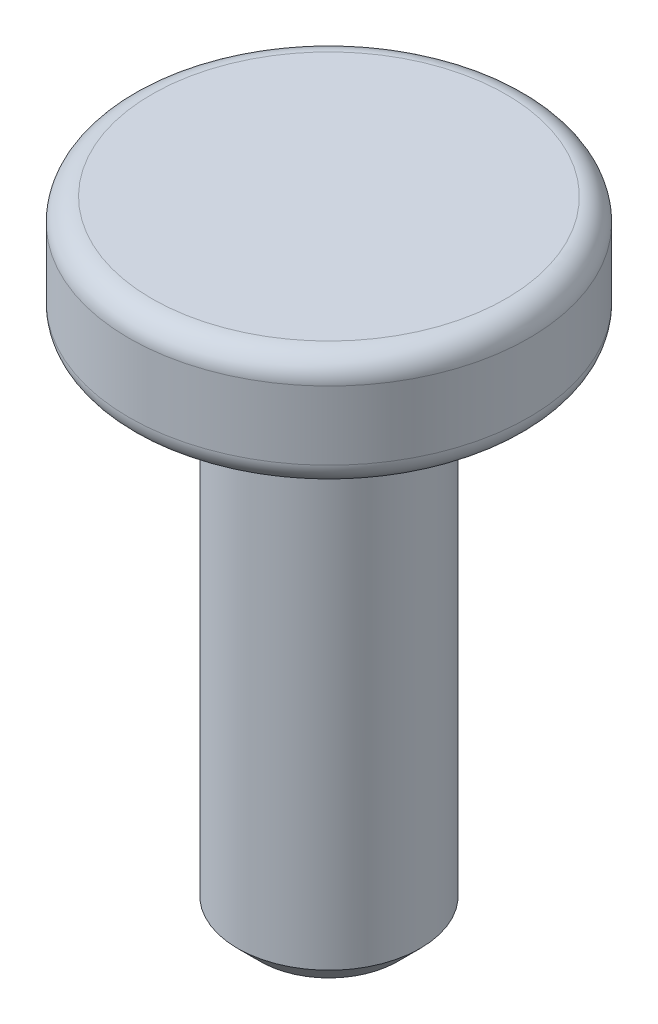
ISO-10303-21;
HEADER;
FILE_DESCRIPTION(('STEP AP214'),'2;1');
FILE_NAME('part.step','',(''),(''),'','','');
FILE_SCHEMA(('AUTOMOTIVE_DESIGN { 1 0 10303 214 1 1 1 1 }'));
ENDSEC;
DATA;
#1=APPLICATION_CONTEXT('core data for automotive mechanical design processes');
#2=APPLICATION_PROTOCOL_DEFINITION('international standard','automotive_design',2000,#1);
#3=PRODUCT_CONTEXT('',#1,'mechanical');
#4=PRODUCT('Part','Part','',(#3));
#5=PRODUCT_RELATED_PRODUCT_CATEGORY('part','',(#4));
#6=PRODUCT_DEFINITION_FORMATION('','',#4);
#7=PRODUCT_DEFINITION_CONTEXT('part definition',#1,'design');
#8=PRODUCT_DEFINITION('design','',#6,#7);
#9=PRODUCT_DEFINITION_SHAPE('','',#8);
#10=(LENGTH_UNIT() NAMED_UNIT(*) SI_UNIT(.MILLI.,.METRE.));
#11=(NAMED_UNIT(*) PLANE_ANGLE_UNIT() SI_UNIT($,.RADIAN.));
#12=(NAMED_UNIT(*) SI_UNIT($,.STERADIAN.) SOLID_ANGLE_UNIT());
#13=UNCERTAINTY_MEASURE_WITH_UNIT(LENGTH_MEASURE(1.E-05),#10,'distance_accuracy_value','');
#14=(GEOMETRIC_REPRESENTATION_CONTEXT(3) GLOBAL_UNCERTAINTY_ASSIGNED_CONTEXT((#13)) GLOBAL_UNIT_ASSIGNED_CONTEXT((#10,
#11,#12)) REPRESENTATION_CONTEXT('',''));
#15=CARTESIAN_POINT('',(0.,0.,0.));
#16=DIRECTION('',(0.,0.,1.));
#17=DIRECTION('',(1.,0.,0.));
#18=AXIS2_PLACEMENT_3D('',#15,#16,#17);
#19=CARTESIAN_POINT('',(0.,0.,0.));
#20=DIRECTION('',(0.,1.,0.));
#21=DIRECTION('',(0.,0.,1.));
#22=AXIS2_PLACEMENT_3D('',#19,#20,#21);
#23=PLANE('',#22);
#24=CARTESIAN_POINT('',(0.,0.,0.));
#25=DIRECTION('',(0.,1.,0.));
#26=DIRECTION('',(0.,0.,1.));
#27=AXIS2_PLACEMENT_3D('',#24,#25,#26);
#28=CIRCLE('',#27,1.55);
#29=CARTESIAN_POINT('',(0.,0.,1.55));
#30=VERTEX_POINT('',#29);
#31=EDGE_CURVE('E34',#30,#30,#28,.F.);
#32=ORIENTED_EDGE('',*,*,#31,.T.);
#33=EDGE_LOOP('',(#32));
#34=FACE_BOUND('',#33,.T.);
#35=CARTESIAN_POINT('',(0.,0.,0.));
#36=DIRECTION('',(0.,1.,0.));
#37=DIRECTION('',(0.,0.,1.));
#38=AXIS2_PLACEMENT_3D('',#35,#36,#37);
#39=CIRCLE('',#38,0.8);
#40=CARTESIAN_POINT('',(0.,0.,0.8));
#41=VERTEX_POINT('',#40);
#42=EDGE_CURVE('E25',#41,#41,#39,.F.);
#43=ORIENTED_EDGE('',*,*,#42,.F.);
#44=EDGE_LOOP('',(#43));
#45=FACE_BOUND('',#44,.T.);
#46=ADVANCED_FACE('F14',(#34,#45),#23,.F.);
#47=CARTESIAN_POINT('',(0.,1.,0.));
#48=DIRECTION('',(0.,-1.,0.));
#49=DIRECTION('',(0.,0.,-1.));
#50=AXIS2_PLACEMENT_3D('',#47,#48,#49);
#51=CYLINDRICAL_SURFACE('',#50,1.75);
#52=CARTESIAN_POINT('',(0.,0.2,0.));
#53=DIRECTION('',(0.,1.,0.));
#54=DIRECTION('',(0.,0.,1.));
#55=AXIS2_PLACEMENT_3D('',#52,#53,#54);
#56=CIRCLE('',#55,1.75);
#57=CARTESIAN_POINT('',(0.,0.2,1.75));
#58=VERTEX_POINT('',#57);
#59=EDGE_CURVE('E37',#58,#58,#56,.T.);
#60=ORIENTED_EDGE('',*,*,#59,.T.);
#61=EDGE_LOOP('',(#60));
#62=FACE_BOUND('',#61,.T.);
#63=CARTESIAN_POINT('',(0.,0.8,0.));
#64=DIRECTION('',(0.,1.,0.));
#65=DIRECTION('',(0.,0.,1.));
#66=AXIS2_PLACEMENT_3D('',#63,#64,#65);
#67=CIRCLE('',#66,1.75);
#68=CARTESIAN_POINT('',(0.,0.8,1.75));
#69=VERTEX_POINT('',#68);
#70=EDGE_CURVE('E40',#69,#69,#67,.F.);
#71=ORIENTED_EDGE('',*,*,#70,.T.);
#72=EDGE_LOOP('',(#71));
#73=FACE_BOUND('',#72,.T.);
#74=ADVANCED_FACE('F44',(#62,#73),#51,.T.);
#75=CARTESIAN_POINT('',(0.,1.,0.));
#76=DIRECTION('',(0.,1.,0.));
#77=DIRECTION('',(0.,0.,1.));
#78=AXIS2_PLACEMENT_3D('',#75,#76,#77);
#79=PLANE('',#78);
#80=CARTESIAN_POINT('',(0.,1.,0.));
#81=DIRECTION('',(0.,1.,0.));
#82=DIRECTION('',(0.,0.,1.));
#83=AXIS2_PLACEMENT_3D('',#80,#81,#82);
#84=CIRCLE('',#83,1.55);
#85=CARTESIAN_POINT('',(0.,1.,1.55));
#86=VERTEX_POINT('',#85);
#87=EDGE_CURVE('E29',#86,#86,#84,.T.);
#88=ORIENTED_EDGE('',*,*,#87,.T.);
#89=EDGE_LOOP('',(#88));
#90=FACE_BOUND('',#89,.T.);
#91=ADVANCED_FACE('F53',(#90),#79,.T.);
#92=CARTESIAN_POINT('',(0.,0.2,0.));
#93=DIRECTION('',(0.,1.,0.));
#94=DIRECTION('',(0.,0.,1.));
#95=AXIS2_PLACEMENT_3D('',#92,#93,#94);
#96=TOROIDAL_SURFACE('',#95,1.55,0.2);
#97=ORIENTED_EDGE('',*,*,#31,.F.);
#98=EDGE_LOOP('',(#97));
#99=FACE_BOUND('',#98,.T.);
#100=ORIENTED_EDGE('',*,*,#59,.F.);
#101=EDGE_LOOP('',(#100));
#102=FACE_BOUND('',#101,.T.);
#103=ADVANCED_FACE('F50',(#99,#102),#96,.T.);
#104=CARTESIAN_POINT('',(0.,0.8,0.));
#105=DIRECTION('',(0.,1.,0.));
#106=DIRECTION('',(0.,0.,1.));
#107=AXIS2_PLACEMENT_3D('',#104,#105,#106);
#108=TOROIDAL_SURFACE('',#107,1.55,0.2);
#109=ORIENTED_EDGE('',*,*,#70,.F.);
#110=EDGE_LOOP('',(#109));
#111=FACE_BOUND('',#110,.T.);
#112=ORIENTED_EDGE('',*,*,#87,.F.);
#113=EDGE_LOOP('',(#112));
#114=FACE_BOUND('',#113,.T.);
#115=ADVANCED_FACE('F46',(#111,#114),#108,.T.);
#116=CARTESIAN_POINT('',(0.,-4.5,0.));
#117=DIRECTION('',(0.,1.,0.));
#118=DIRECTION('',(0.,0.,1.));
#119=AXIS2_PLACEMENT_3D('',#116,#117,#118);
#120=CYLINDRICAL_SURFACE('',#119,0.8);
#121=CARTESIAN_POINT('',(0.,-4.3,0.));
#122=DIRECTION('',(0.,-1.,0.));
#123=DIRECTION('',(0.,0.,-1.));
#124=AXIS2_PLACEMENT_3D('',#121,#122,#123);
#125=CIRCLE('',#124,0.8);
#126=CARTESIAN_POINT('',(0.,-4.3,-0.8));
#127=VERTEX_POINT('',#126);
#128=EDGE_CURVE('E10',#127,#127,#125,.F.);
#129=ORIENTED_EDGE('',*,*,#128,.T.);
#130=EDGE_LOOP('',(#129));
#131=FACE_BOUND('',#130,.T.);
#132=ORIENTED_EDGE('',*,*,#42,.T.);
#133=EDGE_LOOP('',(#132));
#134=FACE_BOUND('',#133,.T.);
#135=ADVANCED_FACE('F49',(#131,#134),#120,.T.);
#136=CARTESIAN_POINT('',(0.,-4.5,0.));
#137=DIRECTION('',(0.,-1.,0.));
#138=DIRECTION('',(0.,0.,-1.));
#139=AXIS2_PLACEMENT_3D('',#136,#137,#138);
#140=PLANE('',#139);
#141=CARTESIAN_POINT('',(0.,-4.5,0.));
#142=DIRECTION('',(0.,-1.,0.));
#143=DIRECTION('',(0.,0.,-1.));
#144=AXIS2_PLACEMENT_3D('',#141,#142,#143);
#145=CIRCLE('',#144,0.6);
#146=CARTESIAN_POINT('',(0.,-4.5,-0.6));
#147=VERTEX_POINT('',#146);
#148=EDGE_CURVE('E21',#147,#147,#145,.T.);
#149=ORIENTED_EDGE('',*,*,#148,.T.);
#150=EDGE_LOOP('',(#149));
#151=FACE_BOUND('',#150,.T.);
#152=ADVANCED_FACE('F78',(#151),#140,.T.);
#153=CARTESIAN_POINT('',(0.,-4.5,0.));
#154=DIRECTION('',(0.,1.,0.));
#155=DIRECTION('',(0.,0.,1.));
#156=AXIS2_PLACEMENT_3D('',#153,#154,#155);
#157=CONICAL_SURFACE('',#156,0.6,0.785398163397446);
#158=ORIENTED_EDGE('',*,*,#128,.F.);
#159=EDGE_LOOP('',(#158));
#160=FACE_BOUND('',#159,.T.);
#161=ORIENTED_EDGE('',*,*,#148,.F.);
#162=EDGE_LOOP('',(#161));
#163=FACE_BOUND('',#162,.T.);
#164=ADVANCED_FACE('F16',(#160,#163),#157,.T.);
#165=CLOSED_SHELL('',(#46,#74,#91,#103,#115,#135,#152,#164));
#166=MANIFOLD_SOLID_BREP('B1',#165);
#167=ADVANCED_BREP_SHAPE_REPRESENTATION('',(#18,#166),#14);
#168=SHAPE_DEFINITION_REPRESENTATION(#9,#167);
ENDSEC;
END-ISO-10303-21;
